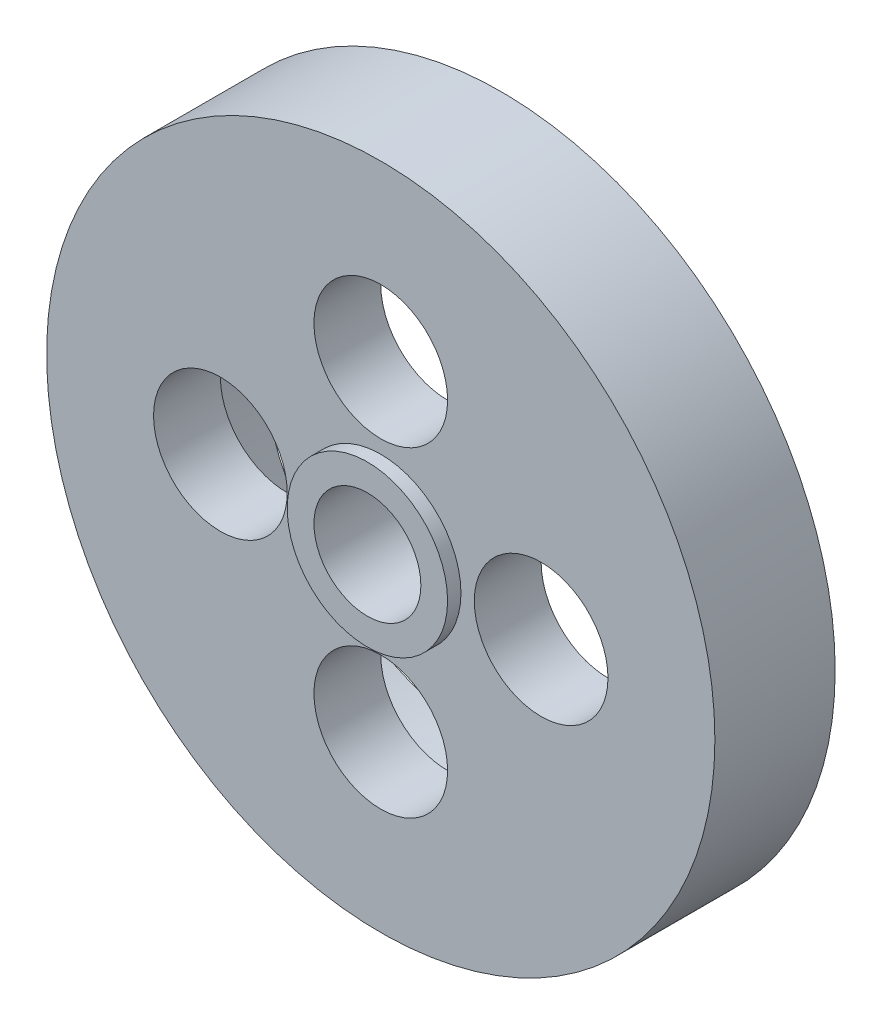
ISO-10303-21;
HEADER;
FILE_DESCRIPTION(('STEP AP214'),'2;1');
FILE_NAME('part.step','',(''),(''),'','','');
FILE_SCHEMA(('AUTOMOTIVE_DESIGN { 1 0 10303 214 1 1 1 1 }'));
ENDSEC;
DATA;
#1=APPLICATION_CONTEXT('core data for automotive mechanical design processes');
#2=APPLICATION_PROTOCOL_DEFINITION('international standard','automotive_design',2000,#1);
#3=PRODUCT_CONTEXT('',#1,'mechanical');
#4=PRODUCT('Part','Part','',(#3));
#5=PRODUCT_RELATED_PRODUCT_CATEGORY('part','',(#4));
#6=PRODUCT_DEFINITION_FORMATION('','',#4);
#7=PRODUCT_DEFINITION_CONTEXT('part definition',#1,'design');
#8=PRODUCT_DEFINITION('design','',#6,#7);
#9=PRODUCT_DEFINITION_SHAPE('','',#8);
#10=(LENGTH_UNIT() NAMED_UNIT(*) SI_UNIT(.MILLI.,.METRE.));
#11=(NAMED_UNIT(*) PLANE_ANGLE_UNIT() SI_UNIT($,.RADIAN.));
#12=(NAMED_UNIT(*) SI_UNIT($,.STERADIAN.) SOLID_ANGLE_UNIT());
#13=UNCERTAINTY_MEASURE_WITH_UNIT(LENGTH_MEASURE(1.E-05),#10,'distance_accuracy_value','');
#14=(GEOMETRIC_REPRESENTATION_CONTEXT(3) GLOBAL_UNCERTAINTY_ASSIGNED_CONTEXT((#13)) GLOBAL_UNIT_ASSIGNED_CONTEXT((#10,
#11,#12)) REPRESENTATION_CONTEXT('',''));
#15=CARTESIAN_POINT('',(0.,0.,0.));
#16=DIRECTION('',(0.,0.,1.));
#17=DIRECTION('',(1.,0.,0.));
#18=AXIS2_PLACEMENT_3D('',#15,#16,#17);
#19=CARTESIAN_POINT('',(0.,0.,9.));
#20=DIRECTION('',(0.,0.,1.));
#21=DIRECTION('',(1.,0.,0.));
#22=AXIS2_PLACEMENT_3D('',#19,#20,#21);
#23=PLANE('',#22);
#24=CARTESIAN_POINT('',(-12.,-3.40806304938355E-13,9.));
#25=DIRECTION('',(0.,0.,1.));
#26=DIRECTION('',(1.,0.,0.));
#27=AXIS2_PLACEMENT_3D('',#24,#25,#26);
#28=CIRCLE('',#27,5.00000000000045);
#29=CARTESIAN_POINT('',(-6.99999999999954,-3.40806304938355E-13,9.));
#30=VERTEX_POINT('',#29);
#31=EDGE_CURVE('E68',#30,#30,#28,.T.);
#32=ORIENTED_EDGE('',*,*,#31,.F.);
#33=EDGE_LOOP('',(#32));
#34=FACE_BOUND('',#33,.T.);
#35=CARTESIAN_POINT('',(12.0000000000003,0.,9.));
#36=DIRECTION('',(0.,0.,1.));
#37=DIRECTION('',(1.,0.,0.));
#38=AXIS2_PLACEMENT_3D('',#35,#36,#37);
#39=CIRCLE('',#38,4.99999999999994);
#40=CARTESIAN_POINT('',(17.0000000000003,0.,9.));
#41=VERTEX_POINT('',#40);
#42=EDGE_CURVE('E60',#41,#41,#39,.T.);
#43=ORIENTED_EDGE('',*,*,#42,.F.);
#44=EDGE_LOOP('',(#43));
#45=FACE_BOUND('',#44,.T.);
#46=CARTESIAN_POINT('',(0.,12.,9.));
#47=DIRECTION('',(0.,0.,1.));
#48=DIRECTION('',(1.,0.,0.));
#49=AXIS2_PLACEMENT_3D('',#46,#47,#48);
#50=CIRCLE('',#49,5.);
#51=CARTESIAN_POINT('',(5.,12.,9.));
#52=VERTEX_POINT('',#51);
#53=EDGE_CURVE('E55',#52,#52,#50,.T.);
#54=ORIENTED_EDGE('',*,*,#53,.F.);
#55=EDGE_LOOP('',(#54));
#56=FACE_BOUND('',#55,.T.);
#57=CARTESIAN_POINT('',(0.,0.,9.));
#58=DIRECTION('',(0.,0.,1.));
#59=DIRECTION('',(1.,0.,0.));
#60=AXIS2_PLACEMENT_3D('',#57,#58,#59);
#61=CIRCLE('',#60,25.);
#62=CARTESIAN_POINT('',(25.,0.,9.));
#63=VERTEX_POINT('',#62);
#64=EDGE_CURVE('E10',#63,#63,#61,.T.);
#65=ORIENTED_EDGE('',*,*,#64,.T.);
#66=EDGE_LOOP('',(#65));
#67=FACE_BOUND('',#66,.T.);
#68=CARTESIAN_POINT('',(0.,-12.,9.));
#69=DIRECTION('',(0.,0.,1.));
#70=DIRECTION('',(1.,0.,0.));
#71=AXIS2_PLACEMENT_3D('',#68,#69,#70);
#72=CIRCLE('',#71,5.);
#73=CARTESIAN_POINT('',(4.99999999999992,-12.,9.));
#74=VERTEX_POINT('',#73);
#75=EDGE_CURVE('E64',#74,#74,#72,.T.);
#76=ORIENTED_EDGE('',*,*,#75,.F.);
#77=EDGE_LOOP('',(#76));
#78=FACE_BOUND('',#77,.T.);
#79=CARTESIAN_POINT('',(0.,0.,9.));
#80=DIRECTION('',(0.,0.,1.));
#81=DIRECTION('',(1.,0.,0.));
#82=AXIS2_PLACEMENT_3D('',#79,#80,#81);
#83=CIRCLE('',#82,6.);
#84=CARTESIAN_POINT('',(6.,0.,9.));
#85=VERTEX_POINT('',#84);
#86=EDGE_CURVE('E97',#85,#85,#83,.T.);
#87=ORIENTED_EDGE('',*,*,#86,.F.);
#88=EDGE_LOOP('',(#87));
#89=FACE_BOUND('',#88,.T.);
#90=ADVANCED_FACE('F40',(#34,#45,#56,#67,#78,#89),#23,.T.);
#91=CARTESIAN_POINT('',(0.,12.,9.));
#92=DIRECTION('',(0.,0.,-1.));
#93=DIRECTION('',(-1.,0.,0.));
#94=AXIS2_PLACEMENT_3D('',#91,#92,#93);
#95=CYLINDRICAL_SURFACE('',#94,5.);
#96=ORIENTED_EDGE('',*,*,#53,.T.);
#97=EDGE_LOOP('',(#96));
#98=FACE_BOUND('',#97,.T.);
#99=CARTESIAN_POINT('',(0.,12.,4.));
#100=DIRECTION('',(0.,0.,-1.));
#101=DIRECTION('',(-1.,0.,0.));
#102=AXIS2_PLACEMENT_3D('',#99,#100,#101);
#103=CIRCLE('',#102,5.);
#104=CARTESIAN_POINT('',(-5.,12.,4.));
#105=VERTEX_POINT('',#104);
#106=EDGE_CURVE('E72',#105,#105,#103,.T.);
#107=ORIENTED_EDGE('',*,*,#106,.T.);
#108=EDGE_LOOP('',(#107));
#109=FACE_BOUND('',#108,.T.);
#110=ADVANCED_FACE('F127',(#98,#109),#95,.F.);
#111=CARTESIAN_POINT('',(0.,0.,9.));
#112=DIRECTION('',(0.,0.,-1.));
#113=DIRECTION('',(-1.,0.,0.));
#114=AXIS2_PLACEMENT_3D('',#111,#112,#113);
#115=CYLINDRICAL_SURFACE('',#114,4.);
#116=CARTESIAN_POINT('',(0.,0.,4.));
#117=DIRECTION('',(0.,0.,-1.));
#118=DIRECTION('',(-1.,0.,0.));
#119=AXIS2_PLACEMENT_3D('',#116,#117,#118);
#120=CIRCLE('',#119,4.);
#121=CARTESIAN_POINT('',(-4.,0.,4.));
#122=VERTEX_POINT('',#121);
#123=EDGE_CURVE('E76',#122,#122,#120,.T.);
#124=ORIENTED_EDGE('',*,*,#123,.T.);
#125=EDGE_LOOP('',(#124));
#126=FACE_BOUND('',#125,.T.);
#127=CARTESIAN_POINT('',(0.,0.,10.));
#128=DIRECTION('',(0.,0.,1.));
#129=DIRECTION('',(1.,0.,0.));
#130=AXIS2_PLACEMENT_3D('',#127,#128,#129);
#131=CIRCLE('',#130,4.);
#132=CARTESIAN_POINT('',(4.,0.,10.));
#133=VERTEX_POINT('',#132);
#134=EDGE_CURVE('E101',#133,#133,#131,.T.);
#135=ORIENTED_EDGE('',*,*,#134,.T.);
#136=EDGE_LOOP('',(#135));
#137=FACE_BOUND('',#136,.T.);
#138=ADVANCED_FACE('F109',(#126,#137),#115,.F.);
#139=CARTESIAN_POINT('',(12.0000000000003,0.,9.));
#140=DIRECTION('',(0.,0.,-1.));
#141=DIRECTION('',(-1.,0.,0.));
#142=AXIS2_PLACEMENT_3D('',#139,#140,#141);
#143=CYLINDRICAL_SURFACE('',#142,4.99999999999994);
#144=ORIENTED_EDGE('',*,*,#42,.T.);
#145=EDGE_LOOP('',(#144));
#146=FACE_BOUND('',#145,.T.);
#147=CARTESIAN_POINT('',(12.0000000000003,0.,4.));
#148=DIRECTION('',(0.,0.,-1.));
#149=DIRECTION('',(-1.,0.,0.));
#150=AXIS2_PLACEMENT_3D('',#147,#148,#149);
#151=CIRCLE('',#150,4.99999999999994);
#152=CARTESIAN_POINT('',(7.00000000000039,0.,4.));
#153=VERTEX_POINT('',#152);
#154=EDGE_CURVE('E80',#153,#153,#151,.T.);
#155=ORIENTED_EDGE('',*,*,#154,.T.);
#156=EDGE_LOOP('',(#155));
#157=FACE_BOUND('',#156,.T.);
#158=ADVANCED_FACE('F164',(#146,#157),#143,.F.);
#159=CARTESIAN_POINT('',(0.,-12.,9.));
#160=DIRECTION('',(0.,0.,-1.));
#161=DIRECTION('',(-1.,0.,0.));
#162=AXIS2_PLACEMENT_3D('',#159,#160,#161);
#163=CYLINDRICAL_SURFACE('',#162,5.);
#164=ORIENTED_EDGE('',*,*,#75,.T.);
#165=EDGE_LOOP('',(#164));
#166=FACE_BOUND('',#165,.T.);
#167=CARTESIAN_POINT('',(0.,-12.,4.));
#168=DIRECTION('',(0.,0.,-1.));
#169=DIRECTION('',(-1.,0.,0.));
#170=AXIS2_PLACEMENT_3D('',#167,#168,#169);
#171=CIRCLE('',#170,5.);
#172=CARTESIAN_POINT('',(-5.00000000000008,-12.,4.));
#173=VERTEX_POINT('',#172);
#174=EDGE_CURVE('E84',#173,#173,#171,.T.);
#175=ORIENTED_EDGE('',*,*,#174,.T.);
#176=EDGE_LOOP('',(#175));
#177=FACE_BOUND('',#176,.T.);
#178=ADVANCED_FACE('F147',(#166,#177),#163,.F.);
#179=CARTESIAN_POINT('',(-12.,-3.40806304938355E-13,9.));
#180=DIRECTION('',(0.,0.,-1.));
#181=DIRECTION('',(-1.,0.,0.));
#182=AXIS2_PLACEMENT_3D('',#179,#180,#181);
#183=CYLINDRICAL_SURFACE('',#182,5.00000000000045);
#184=ORIENTED_EDGE('',*,*,#31,.T.);
#185=EDGE_LOOP('',(#184));
#186=FACE_BOUND('',#185,.T.);
#187=CARTESIAN_POINT('',(-12.,-3.40806304938355E-13,4.));
#188=DIRECTION('',(0.,0.,-1.));
#189=DIRECTION('',(-1.,0.,0.));
#190=AXIS2_PLACEMENT_3D('',#187,#188,#189);
#191=CIRCLE('',#190,5.00000000000045);
#192=CARTESIAN_POINT('',(-17.0000000000004,-3.40806304938355E-13,4.));
#193=VERTEX_POINT('',#192);
#194=EDGE_CURVE('E44',#193,#193,#191,.T.);
#195=ORIENTED_EDGE('',*,*,#194,.T.);
#196=EDGE_LOOP('',(#195));
#197=FACE_BOUND('',#196,.T.);
#198=ADVANCED_FACE('F140',(#186,#197),#183,.F.);
#199=CARTESIAN_POINT('',(0.,0.,0.));
#200=DIRECTION('',(0.,0.,1.));
#201=DIRECTION('',(1.,0.,0.));
#202=AXIS2_PLACEMENT_3D('',#199,#200,#201);
#203=PLANE('',#202);
#204=CARTESIAN_POINT('',(0.,0.,0.));
#205=DIRECTION('',(0.,0.,-1.));
#206=DIRECTION('',(-1.,0.,0.));
#207=AXIS2_PLACEMENT_3D('',#204,#205,#206);
#208=CIRCLE('',#207,18.);
#209=CARTESIAN_POINT('',(-18.,0.,0.));
#210=VERTEX_POINT('',#209);
#211=EDGE_CURVE('E88',#210,#210,#208,.T.);
#212=ORIENTED_EDGE('',*,*,#211,.F.);
#213=EDGE_LOOP('',(#212));
#214=FACE_BOUND('',#213,.T.);
#215=CARTESIAN_POINT('',(0.,0.,0.));
#216=DIRECTION('',(0.,0.,1.));
#217=DIRECTION('',(1.,0.,0.));
#218=AXIS2_PLACEMENT_3D('',#215,#216,#217);
#219=CIRCLE('',#218,25.);
#220=CARTESIAN_POINT('',(25.,0.,0.));
#221=VERTEX_POINT('',#220);
#222=EDGE_CURVE('E49',#221,#221,#219,.T.);
#223=ORIENTED_EDGE('',*,*,#222,.F.);
#224=EDGE_LOOP('',(#223));
#225=FACE_BOUND('',#224,.T.);
#226=ADVANCED_FACE('F138',(#214,#225),#203,.F.);
#227=CARTESIAN_POINT('',(0.,0.,9.));
#228=DIRECTION('',(0.,0.,-1.));
#229=DIRECTION('',(-1.,0.,0.));
#230=AXIS2_PLACEMENT_3D('',#227,#228,#229);
#231=CYLINDRICAL_SURFACE('',#230,25.);
#232=ORIENTED_EDGE('',*,*,#64,.F.);
#233=EDGE_LOOP('',(#232));
#234=FACE_BOUND('',#233,.T.);
#235=ORIENTED_EDGE('',*,*,#222,.T.);
#236=EDGE_LOOP('',(#235));
#237=FACE_BOUND('',#236,.T.);
#238=ADVANCED_FACE('F42',(#234,#237),#231,.T.);
#239=CARTESIAN_POINT('',(0.,0.,4.));
#240=DIRECTION('',(0.,0.,-1.));
#241=DIRECTION('',(-1.,0.,0.));
#242=AXIS2_PLACEMENT_3D('',#239,#240,#241);
#243=CYLINDRICAL_SURFACE('',#242,18.);
#244=CARTESIAN_POINT('',(0.,0.,4.));
#245=DIRECTION('',(0.,0.,-1.));
#246=DIRECTION('',(-1.,0.,0.));
#247=AXIS2_PLACEMENT_3D('',#244,#245,#246);
#248=CIRCLE('',#247,18.);
#249=CARTESIAN_POINT('',(-18.,0.,4.));
#250=VERTEX_POINT('',#249);
#251=EDGE_CURVE('E92',#250,#250,#248,.T.);
#252=ORIENTED_EDGE('',*,*,#251,.F.);
#253=EDGE_LOOP('',(#252));
#254=FACE_BOUND('',#253,.T.);
#255=ORIENTED_EDGE('',*,*,#211,.T.);
#256=EDGE_LOOP('',(#255));
#257=FACE_BOUND('',#256,.T.);
#258=ADVANCED_FACE('F123',(#254,#257),#243,.F.);
#259=CARTESIAN_POINT('',(0.,0.,4.));
#260=DIRECTION('',(0.,0.,-1.));
#261=DIRECTION('',(-1.,0.,0.));
#262=AXIS2_PLACEMENT_3D('',#259,#260,#261);
#263=PLANE('',#262);
#264=ORIENTED_EDGE('',*,*,#106,.F.);
#265=EDGE_LOOP('',(#264));
#266=FACE_BOUND('',#265,.T.);
#267=ORIENTED_EDGE('',*,*,#123,.F.);
#268=EDGE_LOOP('',(#267));
#269=FACE_BOUND('',#268,.T.);
#270=ORIENTED_EDGE('',*,*,#154,.F.);
#271=EDGE_LOOP('',(#270));
#272=FACE_BOUND('',#271,.T.);
#273=ORIENTED_EDGE('',*,*,#174,.F.);
#274=EDGE_LOOP('',(#273));
#275=FACE_BOUND('',#274,.T.);
#276=ORIENTED_EDGE('',*,*,#194,.F.);
#277=EDGE_LOOP('',(#276));
#278=FACE_BOUND('',#277,.T.);
#279=ORIENTED_EDGE('',*,*,#251,.T.);
#280=EDGE_LOOP('',(#279));
#281=FACE_BOUND('',#280,.T.);
#282=ADVANCED_FACE('F114',(#266,#269,#272,#275,#278,#281),#263,.T.);
#283=CARTESIAN_POINT('',(0.,0.,10.));
#284=DIRECTION('',(0.,0.,1.));
#285=DIRECTION('',(1.,0.,0.));
#286=AXIS2_PLACEMENT_3D('',#283,#284,#285);
#287=PLANE('',#286);
#288=CARTESIAN_POINT('',(0.,0.,10.));
#289=DIRECTION('',(0.,0.,1.));
#290=DIRECTION('',(1.,0.,0.));
#291=AXIS2_PLACEMENT_3D('',#288,#289,#290);
#292=CIRCLE('',#291,6.);
#293=CARTESIAN_POINT('',(6.,0.,10.));
#294=VERTEX_POINT('',#293);
#295=EDGE_CURVE('E93',#294,#294,#292,.T.);
#296=ORIENTED_EDGE('',*,*,#295,.T.);
#297=EDGE_LOOP('',(#296));
#298=FACE_BOUND('',#297,.T.);
#299=ORIENTED_EDGE('',*,*,#134,.F.);
#300=EDGE_LOOP('',(#299));
#301=FACE_BOUND('',#300,.T.);
#302=ADVANCED_FACE('F111',(#298,#301),#287,.T.);
#303=CARTESIAN_POINT('',(0.,0.,10.));
#304=DIRECTION('',(0.,0.,-1.));
#305=DIRECTION('',(-1.,0.,0.));
#306=AXIS2_PLACEMENT_3D('',#303,#304,#305);
#307=CYLINDRICAL_SURFACE('',#306,6.);
#308=ORIENTED_EDGE('',*,*,#295,.F.);
#309=EDGE_LOOP('',(#308));
#310=FACE_BOUND('',#309,.T.);
#311=ORIENTED_EDGE('',*,*,#86,.T.);
#312=EDGE_LOOP('',(#311));
#313=FACE_BOUND('',#312,.T.);
#314=ADVANCED_FACE('F113',(#310,#313),#307,.T.);
#315=CLOSED_SHELL('',(#90,#110,#138,#158,#178,#198,#226,#238,#258,#282,#302,#314));
#316=MANIFOLD_SOLID_BREP('B2',#315);
#317=ADVANCED_BREP_SHAPE_REPRESENTATION('',(#18,#316),#14);
#318=SHAPE_DEFINITION_REPRESENTATION(#9,#317);
ENDSEC;
END-ISO-10303-21;
